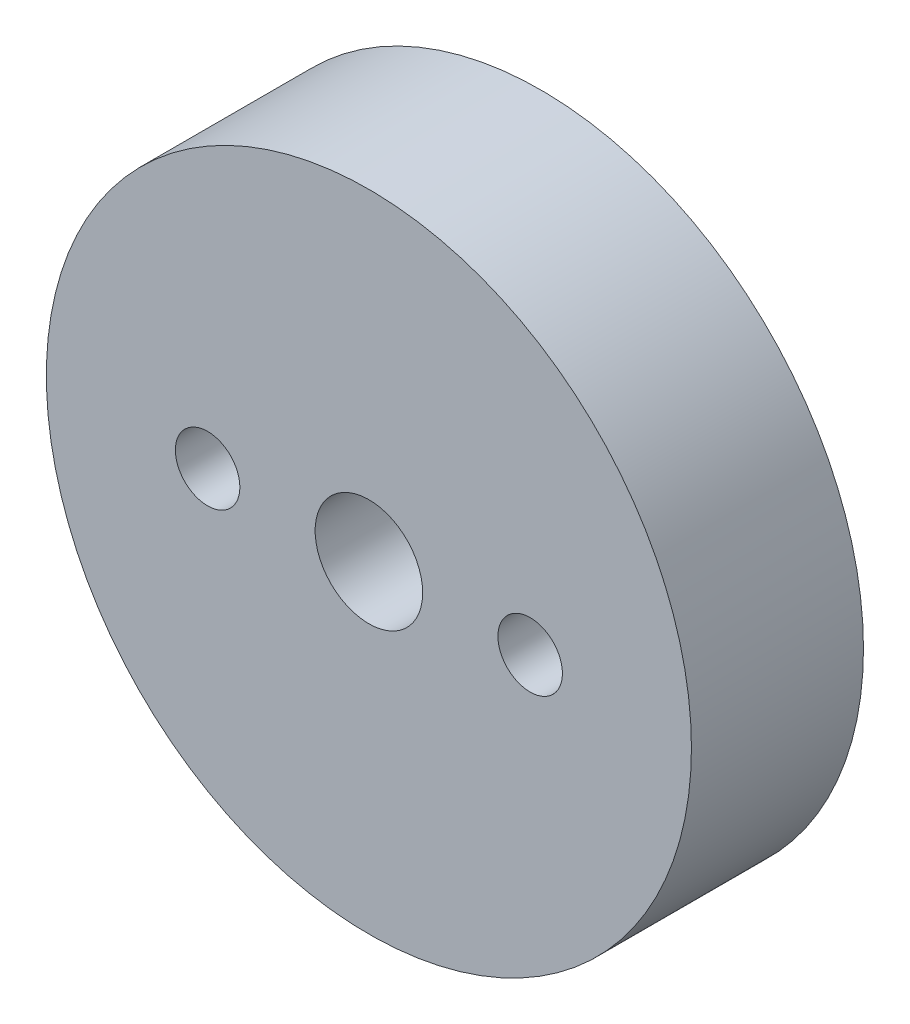
ISO-10303-21;
HEADER;
FILE_DESCRIPTION(('STEP AP214'),'2;1');
FILE_NAME('part.step','',(''),(''),'','','');
FILE_SCHEMA(('AUTOMOTIVE_DESIGN { 1 0 10303 214 1 1 1 1 }'));
ENDSEC;
DATA;
#1=APPLICATION_CONTEXT('core data for automotive mechanical design processes');
#2=APPLICATION_PROTOCOL_DEFINITION('international standard','automotive_design',2000,#1);
#3=PRODUCT_CONTEXT('',#1,'mechanical');
#4=PRODUCT('Part','Part','',(#3));
#5=PRODUCT_RELATED_PRODUCT_CATEGORY('part','',(#4));
#6=PRODUCT_DEFINITION_FORMATION('','',#4);
#7=PRODUCT_DEFINITION_CONTEXT('part definition',#1,'design');
#8=PRODUCT_DEFINITION('design','',#6,#7);
#9=PRODUCT_DEFINITION_SHAPE('','',#8);
#10=(LENGTH_UNIT() NAMED_UNIT(*) SI_UNIT(.MILLI.,.METRE.));
#11=(NAMED_UNIT(*) PLANE_ANGLE_UNIT() SI_UNIT($,.RADIAN.));
#12=(NAMED_UNIT(*) SI_UNIT($,.STERADIAN.) SOLID_ANGLE_UNIT());
#13=UNCERTAINTY_MEASURE_WITH_UNIT(LENGTH_MEASURE(1.E-05),#10,'distance_accuracy_value','');
#14=(GEOMETRIC_REPRESENTATION_CONTEXT(3) GLOBAL_UNCERTAINTY_ASSIGNED_CONTEXT((#13)) GLOBAL_UNIT_ASSIGNED_CONTEXT((#10,
#11,#12)) REPRESENTATION_CONTEXT('',''));
#15=CARTESIAN_POINT('',(0.,0.,0.));
#16=DIRECTION('',(0.,0.,1.));
#17=DIRECTION('',(1.,0.,0.));
#18=AXIS2_PLACEMENT_3D('',#15,#16,#17);
#19=CARTESIAN_POINT('',(0.,0.,8.));
#20=DIRECTION('',(0.,0.,1.));
#21=DIRECTION('',(1.,0.,0.));
#22=AXIS2_PLACEMENT_3D('',#19,#20,#21);
#23=PLANE('',#22);
#24=CARTESIAN_POINT('',(7.5,0.,8.));
#25=DIRECTION('',(0.,0.,1.));
#26=DIRECTION('',(1.,0.,0.));
#27=AXIS2_PLACEMENT_3D('',#24,#25,#26);
#28=CIRCLE('',#27,1.5);
#29=CARTESIAN_POINT('',(9.,0.,8.));
#30=VERTEX_POINT('',#29);
#31=EDGE_CURVE('E47',#30,#30,#28,.T.);
#32=ORIENTED_EDGE('',*,*,#31,.F.);
#33=EDGE_LOOP('',(#32));
#34=FACE_BOUND('',#33,.T.);
#35=CARTESIAN_POINT('',(0.,0.,8.));
#36=DIRECTION('',(0.,0.,1.));
#37=DIRECTION('',(1.,0.,0.));
#38=AXIS2_PLACEMENT_3D('',#35,#36,#37);
#39=CIRCLE('',#38,15.);
#40=CARTESIAN_POINT('',(15.,0.,8.));
#41=VERTEX_POINT('',#40);
#42=EDGE_CURVE('E10',#41,#41,#39,.T.);
#43=ORIENTED_EDGE('',*,*,#42,.T.);
#44=EDGE_LOOP('',(#43));
#45=FACE_BOUND('',#44,.T.);
#46=CARTESIAN_POINT('',(0.,0.,8.));
#47=DIRECTION('',(0.,0.,1.));
#48=DIRECTION('',(1.,0.,0.));
#49=AXIS2_PLACEMENT_3D('',#46,#47,#48);
#50=CIRCLE('',#49,2.5);
#51=CARTESIAN_POINT('',(2.5,0.,8.));
#52=VERTEX_POINT('',#51);
#53=EDGE_CURVE('E42',#52,#52,#50,.T.);
#54=ORIENTED_EDGE('',*,*,#53,.F.);
#55=EDGE_LOOP('',(#54));
#56=FACE_BOUND('',#55,.T.);
#57=CARTESIAN_POINT('',(-7.5,0.,8.));
#58=DIRECTION('',(0.,0.,1.));
#59=DIRECTION('',(1.,0.,0.));
#60=AXIS2_PLACEMENT_3D('',#57,#58,#59);
#61=CIRCLE('',#60,1.5);
#62=CARTESIAN_POINT('',(-6.,0.,8.));
#63=VERTEX_POINT('',#62);
#64=EDGE_CURVE('E53',#63,#63,#61,.T.);
#65=ORIENTED_EDGE('',*,*,#64,.F.);
#66=EDGE_LOOP('',(#65));
#67=FACE_BOUND('',#66,.T.);
#68=ADVANCED_FACE('F31',(#34,#45,#56,#67),#23,.T.);
#69=CARTESIAN_POINT('',(0.,0.,0.));
#70=DIRECTION('',(0.,0.,1.));
#71=DIRECTION('',(1.,0.,0.));
#72=AXIS2_PLACEMENT_3D('',#69,#70,#71);
#73=PLANE('',#72);
#74=CARTESIAN_POINT('',(7.5,0.,0.));
#75=DIRECTION('',(0.,0.,1.));
#76=DIRECTION('',(1.,0.,0.));
#77=AXIS2_PLACEMENT_3D('',#74,#75,#76);
#78=CIRCLE('',#77,1.5);
#79=CARTESIAN_POINT('',(9.,0.,0.));
#80=VERTEX_POINT('',#79);
#81=EDGE_CURVE('E50',#80,#80,#78,.T.);
#82=ORIENTED_EDGE('',*,*,#81,.T.);
#83=EDGE_LOOP('',(#82));
#84=FACE_BOUND('',#83,.T.);
#85=CARTESIAN_POINT('',(0.,0.,0.));
#86=DIRECTION('',(0.,0.,1.));
#87=DIRECTION('',(1.,0.,0.));
#88=AXIS2_PLACEMENT_3D('',#85,#86,#87);
#89=CIRCLE('',#88,15.);
#90=CARTESIAN_POINT('',(15.,0.,0.));
#91=VERTEX_POINT('',#90);
#92=EDGE_CURVE('E35',#91,#91,#89,.T.);
#93=ORIENTED_EDGE('',*,*,#92,.F.);
#94=EDGE_LOOP('',(#93));
#95=FACE_BOUND('',#94,.T.);
#96=CARTESIAN_POINT('',(0.,0.,0.));
#97=DIRECTION('',(0.,0.,1.));
#98=DIRECTION('',(1.,0.,0.));
#99=AXIS2_PLACEMENT_3D('',#96,#97,#98);
#100=CIRCLE('',#99,2.5);
#101=CARTESIAN_POINT('',(2.5,0.,0.));
#102=VERTEX_POINT('',#101);
#103=EDGE_CURVE('E44',#102,#102,#100,.T.);
#104=ORIENTED_EDGE('',*,*,#103,.T.);
#105=EDGE_LOOP('',(#104));
#106=FACE_BOUND('',#105,.T.);
#107=CARTESIAN_POINT('',(-7.5,0.,0.));
#108=DIRECTION('',(0.,0.,1.));
#109=DIRECTION('',(1.,0.,0.));
#110=AXIS2_PLACEMENT_3D('',#107,#108,#109);
#111=CIRCLE('',#110,1.5);
#112=CARTESIAN_POINT('',(-6.,0.,0.));
#113=VERTEX_POINT('',#112);
#114=EDGE_CURVE('E56',#113,#113,#111,.T.);
#115=ORIENTED_EDGE('',*,*,#114,.T.);
#116=EDGE_LOOP('',(#115));
#117=FACE_BOUND('',#116,.T.);
#118=ADVANCED_FACE('F66',(#84,#95,#106,#117),#73,.F.);
#119=CARTESIAN_POINT('',(0.,0.,8.));
#120=DIRECTION('',(0.,0.,-1.));
#121=DIRECTION('',(-1.,0.,0.));
#122=AXIS2_PLACEMENT_3D('',#119,#120,#121);
#123=CYLINDRICAL_SURFACE('',#122,15.);
#124=ORIENTED_EDGE('',*,*,#42,.F.);
#125=EDGE_LOOP('',(#124));
#126=FACE_BOUND('',#125,.T.);
#127=ORIENTED_EDGE('',*,*,#92,.T.);
#128=EDGE_LOOP('',(#127));
#129=FACE_BOUND('',#128,.T.);
#130=ADVANCED_FACE('F33',(#126,#129),#123,.T.);
#131=CARTESIAN_POINT('',(0.,0.,8.));
#132=DIRECTION('',(0.,0.,-1.));
#133=DIRECTION('',(-1.,0.,0.));
#134=AXIS2_PLACEMENT_3D('',#131,#132,#133);
#135=CYLINDRICAL_SURFACE('',#134,2.5);
#136=ORIENTED_EDGE('',*,*,#53,.T.);
#137=EDGE_LOOP('',(#136));
#138=FACE_BOUND('',#137,.T.);
#139=ORIENTED_EDGE('',*,*,#103,.F.);
#140=EDGE_LOOP('',(#139));
#141=FACE_BOUND('',#140,.T.);
#142=ADVANCED_FACE('F75',(#138,#141),#135,.F.);
#143=CARTESIAN_POINT('',(7.5,0.,8.));
#144=DIRECTION('',(0.,0.,-1.));
#145=DIRECTION('',(-1.,0.,0.));
#146=AXIS2_PLACEMENT_3D('',#143,#144,#145);
#147=CYLINDRICAL_SURFACE('',#146,1.5);
#148=ORIENTED_EDGE('',*,*,#31,.T.);
#149=EDGE_LOOP('',(#148));
#150=FACE_BOUND('',#149,.T.);
#151=ORIENTED_EDGE('',*,*,#81,.F.);
#152=EDGE_LOOP('',(#151));
#153=FACE_BOUND('',#152,.T.);
#154=ADVANCED_FACE('F78',(#150,#153),#147,.F.);
#155=CARTESIAN_POINT('',(-7.5,0.,8.));
#156=DIRECTION('',(0.,0.,-1.));
#157=DIRECTION('',(-1.,0.,0.));
#158=AXIS2_PLACEMENT_3D('',#155,#156,#157);
#159=CYLINDRICAL_SURFACE('',#158,1.5);
#160=ORIENTED_EDGE('',*,*,#64,.T.);
#161=EDGE_LOOP('',(#160));
#162=FACE_BOUND('',#161,.T.);
#163=ORIENTED_EDGE('',*,*,#114,.F.);
#164=EDGE_LOOP('',(#163));
#165=FACE_BOUND('',#164,.T.);
#166=ADVANCED_FACE('F62',(#162,#165),#159,.F.);
#167=CLOSED_SHELL('',(#68,#118,#130,#142,#154,#166));
#168=MANIFOLD_SOLID_BREP('B2',#167);
#169=ADVANCED_BREP_SHAPE_REPRESENTATION('',(#18,#168),#14);
#170=SHAPE_DEFINITION_REPRESENTATION(#9,#169);
ENDSEC;
END-ISO-10303-21;
